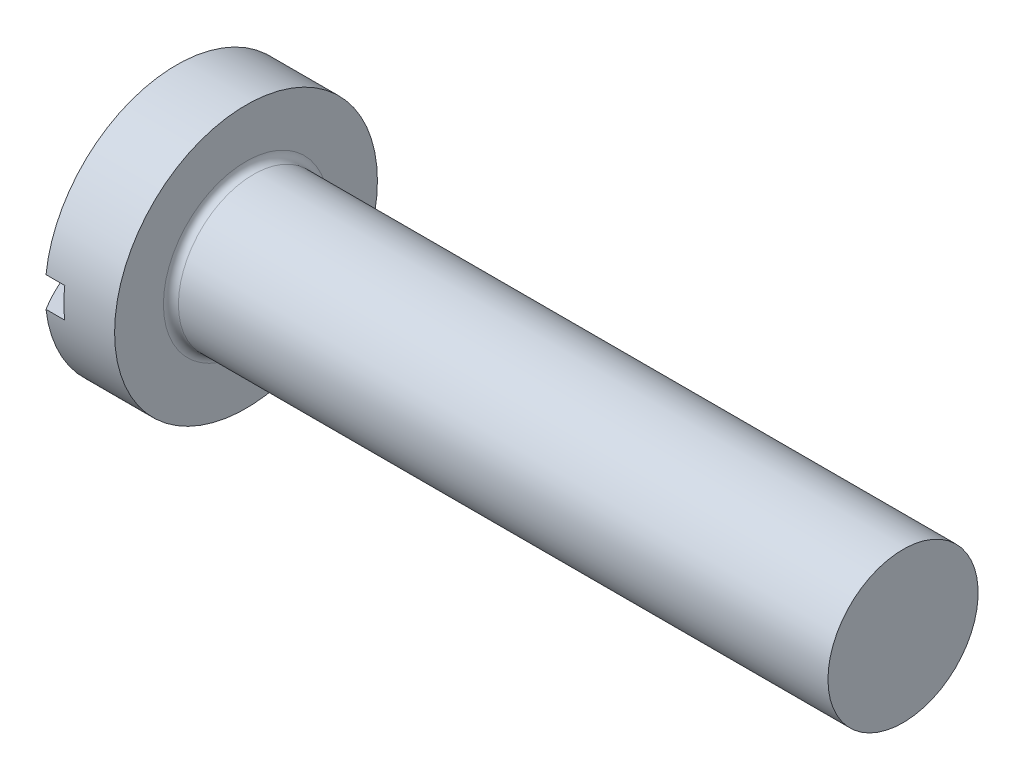
ISO-10303-21;
HEADER;
FILE_DESCRIPTION(('STEP AP214'),'2;1');
FILE_NAME('part.step','',(''),(''),'','','');
FILE_SCHEMA(('AUTOMOTIVE_DESIGN { 1 0 10303 214 1 1 1 1 }'));
ENDSEC;
DATA;
#1=APPLICATION_CONTEXT('core data for automotive mechanical design processes');
#2=APPLICATION_PROTOCOL_DEFINITION('international standard','automotive_design',2000,#1);
#3=PRODUCT_CONTEXT('',#1,'mechanical');
#4=PRODUCT('Part','Part','',(#3));
#5=PRODUCT_RELATED_PRODUCT_CATEGORY('part','',(#4));
#6=PRODUCT_DEFINITION_FORMATION('','',#4);
#7=PRODUCT_DEFINITION_CONTEXT('part definition',#1,'design');
#8=PRODUCT_DEFINITION('design','',#6,#7);
#9=PRODUCT_DEFINITION_SHAPE('','',#8);
#10=(LENGTH_UNIT() NAMED_UNIT(*) SI_UNIT(.MILLI.,.METRE.));
#11=(NAMED_UNIT(*) PLANE_ANGLE_UNIT() SI_UNIT($,.RADIAN.));
#12=(NAMED_UNIT(*) SI_UNIT($,.STERADIAN.) SOLID_ANGLE_UNIT());
#13=UNCERTAINTY_MEASURE_WITH_UNIT(LENGTH_MEASURE(1.E-05),#10,'distance_accuracy_value','');
#14=(GEOMETRIC_REPRESENTATION_CONTEXT(3) GLOBAL_UNCERTAINTY_ASSIGNED_CONTEXT((#13)) GLOBAL_UNIT_ASSIGNED_CONTEXT((#10,
#11,#12)) REPRESENTATION_CONTEXT('',''));
#15=CARTESIAN_POINT('',(0.,0.,0.));
#16=DIRECTION('',(0.,0.,1.));
#17=DIRECTION('',(1.,0.,0.));
#18=AXIS2_PLACEMENT_3D('',#15,#16,#17);
#19=CARTESIAN_POINT('',(13.25,0.,0.));
#20=DIRECTION('',(-1.,0.,0.));
#21=DIRECTION('',(0.,1.,0.));
#22=AXIS2_PLACEMENT_3D('',#19,#20,#21);
#23=SPHERICAL_SURFACE('',#22,13.25);
#24=CARTESIAN_POINT('',(2.,0.,0.));
#25=DIRECTION('',(-1.,0.,0.));
#26=DIRECTION('',(0.,0.,1.));
#27=AXIS2_PLACEMENT_3D('',#24,#25,#26);
#28=CIRCLE('',#27,7.);
#29=CARTESIAN_POINT('',(2.,-0.8,-6.95413546028548));
#30=VERTEX_POINT('',#29);
#31=CARTESIAN_POINT('',(2.,-0.8,6.95413546028548));
#32=VERTEX_POINT('',#31);
#33=EDGE_CURVE('E88',#30,#32,#28,.T.);
#34=ORIENTED_EDGE('',*,*,#33,.T.);
#35=CARTESIAN_POINT('',(13.25,-0.8,0.));
#36=DIRECTION('',(0.,1.,0.));
#37=DIRECTION('',(0.,0.,1.));
#38=AXIS2_PLACEMENT_3D('',#35,#36,#37);
#39=CIRCLE('',#38,13.2258270062783);
#40=EDGE_CURVE('E96',#32,#30,#39,.F.);
#41=ORIENTED_EDGE('',*,*,#40,.T.);
#42=EDGE_LOOP('',(#34,#41));
#43=FACE_BOUND('',#42,.T.);
#44=ADVANCED_FACE('F34',(#43),#23,.T.);
#45=CARTESIAN_POINT('',(2.,0.799999999999998,6.95413546028548));
#46=VERTEX_POINT('',#45);
#47=CARTESIAN_POINT('',(2.,0.8,-6.95413546028548));
#48=VERTEX_POINT('',#47);
#49=EDGE_CURVE('E90',#46,#48,#28,.T.);
#50=ORIENTED_EDGE('',*,*,#49,.T.);
#51=CARTESIAN_POINT('',(13.25,0.799999999999999,0.));
#52=DIRECTION('',(0.,-1.,0.));
#53=DIRECTION('',(0.,0.,-1.));
#54=AXIS2_PLACEMENT_3D('',#51,#52,#53);
#55=CIRCLE('',#54,13.2258270062783);
#56=EDGE_CURVE('E114',#48,#46,#55,.F.);
#57=ORIENTED_EDGE('',*,*,#56,.T.);
#58=EDGE_LOOP('',(#50,#57));
#59=FACE_BOUND('',#58,.T.);
#60=ADVANCED_FACE('F117',(#59),#23,.T.);
#61=CARTESIAN_POINT('',(-25.4,0.,0.));
#62=DIRECTION('',(-1.,0.,0.));
#63=DIRECTION('',(0.,0.,1.));
#64=AXIS2_PLACEMENT_3D('',#61,#62,#63);
#65=CYLINDRICAL_SURFACE('',#64,7.);
#66=CARTESIAN_POINT('',(5.7,0.,0.));
#67=DIRECTION('',(-1.,0.,0.));
#68=DIRECTION('',(0.,0.,1.));
#69=AXIS2_PLACEMENT_3D('',#66,#67,#68);
#70=CIRCLE('',#69,7.);
#71=CARTESIAN_POINT('',(5.7,0.,7.));
#72=VERTEX_POINT('',#71);
#73=EDGE_CURVE('E91',#72,#72,#70,.T.);
#74=ORIENTED_EDGE('',*,*,#73,.T.);
#75=EDGE_LOOP('',(#74));
#76=FACE_BOUND('',#75,.T.);
#77=DIRECTION('',(-1.,0.,0.));
#78=VECTOR('',#77,1.);
#79=CARTESIAN_POINT('',(-25.4,-0.8,-6.95413546028548));
#80=LINE('',#79,#78);
#81=CARTESIAN_POINT('',(3.,-0.8,-6.95413546028548));
#82=VERTEX_POINT('',#81);
#83=EDGE_CURVE('E11',#82,#30,#80,.T.);
#84=ORIENTED_EDGE('',*,*,#83,.F.);
#85=CARTESIAN_POINT('',(3.,0.,0.));
#86=DIRECTION('',(-1.,0.,0.));
#87=DIRECTION('',(0.,0.,1.));
#88=AXIS2_PLACEMENT_3D('',#85,#86,#87);
#89=CIRCLE('',#88,7.);
#90=CARTESIAN_POINT('',(3.,0.8,-6.95413546028548));
#91=VERTEX_POINT('',#90);
#92=EDGE_CURVE('E71',#91,#82,#89,.T.);
#93=ORIENTED_EDGE('',*,*,#92,.F.);
#94=DIRECTION('',(-1.,0.,0.));
#95=VECTOR('',#94,1.);
#96=CARTESIAN_POINT('',(-25.4,0.8,-6.95413546028548));
#97=LINE('',#96,#95);
#98=EDGE_CURVE('E42',#48,#91,#97,.F.);
#99=ORIENTED_EDGE('',*,*,#98,.F.);
#100=ORIENTED_EDGE('',*,*,#49,.F.);
#101=DIRECTION('',(-1.,0.,0.));
#102=VECTOR('',#101,1.);
#103=CARTESIAN_POINT('',(-25.4,0.799999999999998,6.95413546028548));
#104=LINE('',#103,#102);
#105=CARTESIAN_POINT('',(3.,0.799999999999998,6.95413546028548));
#106=VERTEX_POINT('',#105);
#107=EDGE_CURVE('E108',#106,#46,#104,.T.);
#108=ORIENTED_EDGE('',*,*,#107,.F.);
#109=CARTESIAN_POINT('',(3.,-0.8,6.95413546028548));
#110=VERTEX_POINT('',#109);
#111=EDGE_CURVE('E80',#110,#106,#89,.T.);
#112=ORIENTED_EDGE('',*,*,#111,.F.);
#113=DIRECTION('',(-1.,0.,0.));
#114=VECTOR('',#113,1.);
#115=CARTESIAN_POINT('',(-25.4,-0.8,6.95413546028548));
#116=LINE('',#115,#114);
#117=EDGE_CURVE('E78',#32,#110,#116,.F.);
#118=ORIENTED_EDGE('',*,*,#117,.F.);
#119=ORIENTED_EDGE('',*,*,#33,.F.);
#120=EDGE_LOOP('',(#84,#93,#99,#100,#108,#112,#118,#119));
#121=FACE_BOUND('',#120,.T.);
#122=ADVANCED_FACE('F86',(#76,#121),#65,.T.);
#123=CARTESIAN_POINT('',(-25.4,0.,0.));
#124=DIRECTION('',(-1.,0.,0.));
#125=DIRECTION('',(0.,0.,1.));
#126=AXIS2_PLACEMENT_3D('',#123,#124,#125);
#127=CYLINDRICAL_SURFACE('',#126,4.);
#128=CARTESIAN_POINT('',(6.1,0.,0.));
#129=DIRECTION('',(-1.,0.,0.));
#130=DIRECTION('',(0.,0.,1.));
#131=AXIS2_PLACEMENT_3D('',#128,#129,#130);
#132=CIRCLE('',#131,4.);
#133=CARTESIAN_POINT('',(6.1,0.,4.));
#134=VERTEX_POINT('',#133);
#135=EDGE_CURVE('E105',#134,#134,#132,.F.);
#136=ORIENTED_EDGE('',*,*,#135,.T.);
#137=EDGE_LOOP('',(#136));
#138=FACE_BOUND('',#137,.T.);
#139=CARTESIAN_POINT('',(40.7,0.,0.));
#140=DIRECTION('',(-1.,0.,0.));
#141=DIRECTION('',(0.,0.,1.));
#142=AXIS2_PLACEMENT_3D('',#139,#140,#141);
#143=CIRCLE('',#142,4.);
#144=CARTESIAN_POINT('',(40.7,0.,4.));
#145=VERTEX_POINT('',#144);
#146=EDGE_CURVE('E94',#145,#145,#143,.T.);
#147=ORIENTED_EDGE('',*,*,#146,.T.);
#148=EDGE_LOOP('',(#147));
#149=FACE_BOUND('',#148,.T.);
#150=ADVANCED_FACE('F131',(#138,#149),#127,.T.);
#151=CARTESIAN_POINT('',(40.7,4.,0.));
#152=DIRECTION('',(1.,0.,0.));
#153=DIRECTION('',(0.,0.,-1.));
#154=AXIS2_PLACEMENT_3D('',#151,#152,#153);
#155=PLANE('',#154);
#156=ORIENTED_EDGE('',*,*,#146,.F.);
#157=EDGE_LOOP('',(#156));
#158=FACE_BOUND('',#157,.T.);
#159=ADVANCED_FACE('F128',(#158),#155,.T.);
#160=CARTESIAN_POINT('',(5.7,4.,0.));
#161=DIRECTION('',(-1.,0.,0.));
#162=DIRECTION('',(0.,0.,1.));
#163=AXIS2_PLACEMENT_3D('',#160,#161,#162);
#164=PLANE('',#163);
#165=CARTESIAN_POINT('',(5.7,0.,0.));
#166=DIRECTION('',(-1.,0.,0.));
#167=DIRECTION('',(0.,0.,1.));
#168=AXIS2_PLACEMENT_3D('',#165,#166,#167);
#169=CIRCLE('',#168,4.4);
#170=CARTESIAN_POINT('',(5.7,0.,4.4));
#171=VERTEX_POINT('',#170);
#172=EDGE_CURVE('E102',#171,#171,#169,.T.);
#173=ORIENTED_EDGE('',*,*,#172,.T.);
#174=EDGE_LOOP('',(#173));
#175=FACE_BOUND('',#174,.T.);
#176=ORIENTED_EDGE('',*,*,#73,.F.);
#177=EDGE_LOOP('',(#176));
#178=FACE_BOUND('',#177,.T.);
#179=ADVANCED_FACE('F130',(#175,#178),#164,.F.);
#180=CARTESIAN_POINT('',(6.1,0.,0.));
#181=DIRECTION('',(-1.,0.,0.));
#182=DIRECTION('',(0.,0.,1.));
#183=AXIS2_PLACEMENT_3D('',#180,#181,#182);
#184=TOROIDAL_SURFACE('',#183,4.4,0.4);
#185=ORIENTED_EDGE('',*,*,#135,.F.);
#186=EDGE_LOOP('',(#185));
#187=FACE_BOUND('',#186,.T.);
#188=ORIENTED_EDGE('',*,*,#172,.F.);
#189=EDGE_LOOP('',(#188));
#190=FACE_BOUND('',#189,.T.);
#191=ADVANCED_FACE('F36',(#187,#190),#184,.F.);
#192=CARTESIAN_POINT('',(3.,-0.8,7.));
#193=DIRECTION('',(0.,1.,0.));
#194=DIRECTION('',(0.,0.,1.));
#195=AXIS2_PLACEMENT_3D('',#192,#193,#194);
#196=PLANE('',#195);
#197=ORIENTED_EDGE('',*,*,#83,.T.);
#198=ORIENTED_EDGE('',*,*,#40,.F.);
#199=ORIENTED_EDGE('',*,*,#117,.T.);
#200=DIRECTION('',(0.,0.,-1.));
#201=VECTOR('',#200,1.);
#202=CARTESIAN_POINT('',(3.,-0.8,7.));
#203=LINE('',#202,#201);
#204=EDGE_CURVE('E49',#110,#82,#203,.T.);
#205=ORIENTED_EDGE('',*,*,#204,.T.);
#206=EDGE_LOOP('',(#197,#198,#199,#205));
#207=FACE_BOUND('',#206,.T.);
#208=ADVANCED_FACE('F81',(#207),#196,.T.);
#209=CARTESIAN_POINT('',(3.,0.8,-7.));
#210=DIRECTION('',(0.,-1.,0.));
#211=DIRECTION('',(0.,0.,-1.));
#212=AXIS2_PLACEMENT_3D('',#209,#210,#211);
#213=PLANE('',#212);
#214=ORIENTED_EDGE('',*,*,#107,.T.);
#215=ORIENTED_EDGE('',*,*,#56,.F.);
#216=ORIENTED_EDGE('',*,*,#98,.T.);
#217=DIRECTION('',(0.,0.,1.));
#218=VECTOR('',#217,1.);
#219=CARTESIAN_POINT('',(3.,0.8,-7.));
#220=LINE('',#219,#218);
#221=EDGE_CURVE('E74',#91,#106,#220,.T.);
#222=ORIENTED_EDGE('',*,*,#221,.T.);
#223=EDGE_LOOP('',(#214,#215,#216,#222));
#224=FACE_BOUND('',#223,.T.);
#225=ADVANCED_FACE('F111',(#224),#213,.T.);
#226=CARTESIAN_POINT('',(3.,-0.8,7.));
#227=DIRECTION('',(-1.,0.,0.));
#228=DIRECTION('',(0.,0.,1.));
#229=AXIS2_PLACEMENT_3D('',#226,#227,#228);
#230=PLANE('',#229);
#231=ORIENTED_EDGE('',*,*,#221,.F.);
#232=ORIENTED_EDGE('',*,*,#92,.T.);
#233=ORIENTED_EDGE('',*,*,#204,.F.);
#234=ORIENTED_EDGE('',*,*,#111,.T.);
#235=EDGE_LOOP('',(#231,#232,#233,#234));
#236=FACE_BOUND('',#235,.T.);
#237=ADVANCED_FACE('F72',(#236),#230,.T.);
#238=CLOSED_SHELL('',(#44,#60,#122,#150,#159,#179,#191,#208,#225,#237));
#239=MANIFOLD_SOLID_BREP('B2',#238);
#240=ADVANCED_BREP_SHAPE_REPRESENTATION('',(#18,#239),#14);
#241=SHAPE_DEFINITION_REPRESENTATION(#9,#240);
ENDSEC;
END-ISO-10303-21;
